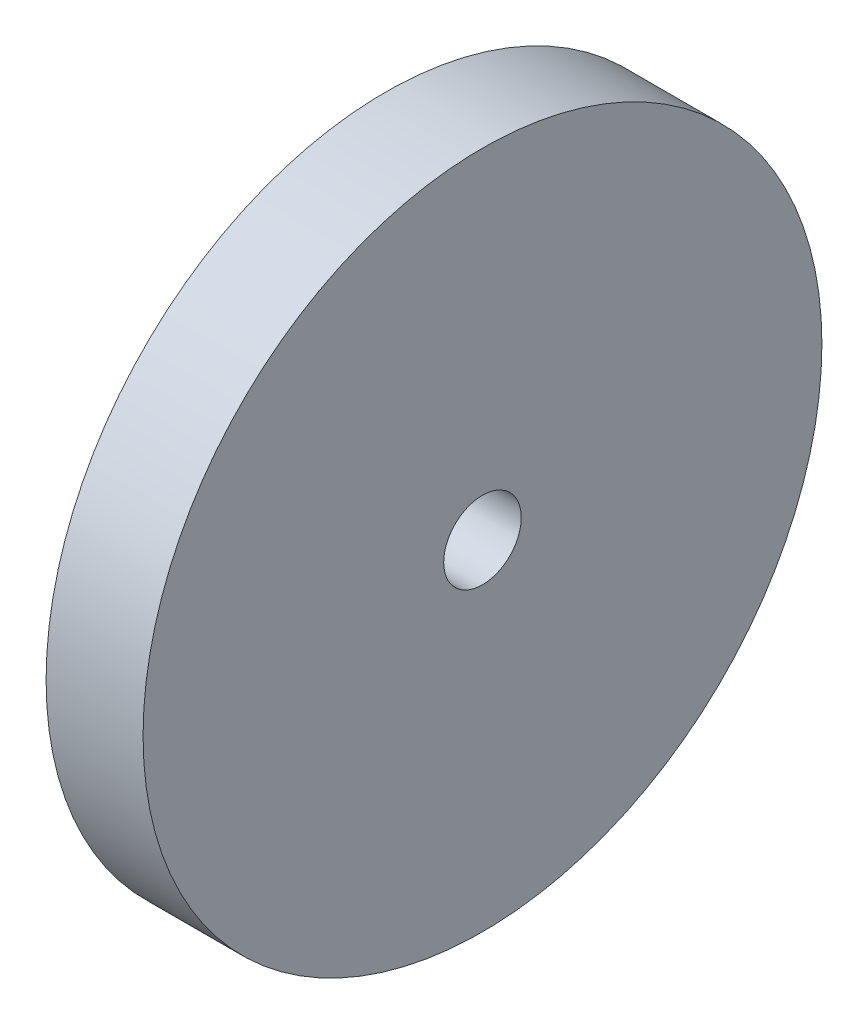
ISO-10303-21;
HEADER;
FILE_DESCRIPTION(('STEP AP214'),'2;1');
FILE_NAME('part.step','',(''),(''),'','','');
FILE_SCHEMA(('AUTOMOTIVE_DESIGN { 1 0 10303 214 1 1 1 1 }'));
ENDSEC;
DATA;
#1=APPLICATION_CONTEXT('core data for automotive mechanical design processes');
#2=APPLICATION_PROTOCOL_DEFINITION('international standard','automotive_design',2000,#1);
#3=PRODUCT_CONTEXT('',#1,'mechanical');
#4=PRODUCT('Part','Part','',(#3));
#5=PRODUCT_RELATED_PRODUCT_CATEGORY('part','',(#4));
#6=PRODUCT_DEFINITION_FORMATION('','',#4);
#7=PRODUCT_DEFINITION_CONTEXT('part definition',#1,'design');
#8=PRODUCT_DEFINITION('design','',#6,#7);
#9=PRODUCT_DEFINITION_SHAPE('','',#8);
#10=(LENGTH_UNIT() NAMED_UNIT(*) SI_UNIT(.MILLI.,.METRE.));
#11=(NAMED_UNIT(*) PLANE_ANGLE_UNIT() SI_UNIT($,.RADIAN.));
#12=(NAMED_UNIT(*) SI_UNIT($,.STERADIAN.) SOLID_ANGLE_UNIT());
#13=UNCERTAINTY_MEASURE_WITH_UNIT(LENGTH_MEASURE(1.E-05),#10,'distance_accuracy_value','');
#14=(GEOMETRIC_REPRESENTATION_CONTEXT(3) GLOBAL_UNCERTAINTY_ASSIGNED_CONTEXT((#13)) GLOBAL_UNIT_ASSIGNED_CONTEXT((#10,
#11,#12)) REPRESENTATION_CONTEXT('',''));
#15=CARTESIAN_POINT('',(0.,0.,0.));
#16=DIRECTION('',(0.,0.,1.));
#17=DIRECTION('',(1.,0.,0.));
#18=AXIS2_PLACEMENT_3D('',#15,#16,#17);
#19=CARTESIAN_POINT('',(0.,4.,0.));
#20=DIRECTION('',(1.,0.,0.));
#21=DIRECTION('',(0.,0.,-1.));
#22=AXIS2_PLACEMENT_3D('',#19,#20,#21);
#23=PLANE('',#22);
#24=CARTESIAN_POINT('',(0.,0.,0.));
#25=DIRECTION('',(-1.,0.,0.));
#26=DIRECTION('',(0.,0.,1.));
#27=AXIS2_PLACEMENT_3D('',#24,#25,#26);
#28=CIRCLE('',#27,4.);
#29=CARTESIAN_POINT('',(0.,0.,4.));
#30=VERTEX_POINT('',#29);
#31=EDGE_CURVE('E54',#30,#30,#28,.T.);
#32=ORIENTED_EDGE('',*,*,#31,.F.);
#33=EDGE_LOOP('',(#32));
#34=FACE_BOUND('',#33,.T.);
#35=CARTESIAN_POINT('',(0.,0.,0.));
#36=DIRECTION('',(-1.,0.,0.));
#37=DIRECTION('',(0.,0.,1.));
#38=AXIS2_PLACEMENT_3D('',#35,#36,#37);
#39=CIRCLE('',#38,35.);
#40=CARTESIAN_POINT('',(0.,0.,35.));
#41=VERTEX_POINT('',#40);
#42=EDGE_CURVE('E10',#41,#41,#39,.T.);
#43=ORIENTED_EDGE('',*,*,#42,.T.);
#44=EDGE_LOOP('',(#43));
#45=FACE_BOUND('',#44,.T.);
#46=ADVANCED_FACE('F37',(#34,#45),#23,.F.);
#47=CARTESIAN_POINT('',(0.,0.,0.));
#48=DIRECTION('',(-1.,0.,0.));
#49=DIRECTION('',(0.,0.,1.));
#50=AXIS2_PLACEMENT_3D('',#47,#48,#49);
#51=CYLINDRICAL_SURFACE('',#50,35.);
#52=ORIENTED_EDGE('',*,*,#42,.F.);
#53=EDGE_LOOP('',(#52));
#54=FACE_BOUND('',#53,.T.);
#55=CARTESIAN_POINT('',(10.,0.,0.));
#56=DIRECTION('',(-1.,0.,0.));
#57=DIRECTION('',(0.,0.,1.));
#58=AXIS2_PLACEMENT_3D('',#55,#56,#57);
#59=CIRCLE('',#58,35.);
#60=CARTESIAN_POINT('',(10.,0.,35.));
#61=VERTEX_POINT('',#60);
#62=EDGE_CURVE('E44',#61,#61,#59,.T.);
#63=ORIENTED_EDGE('',*,*,#62,.T.);
#64=EDGE_LOOP('',(#63));
#65=FACE_BOUND('',#64,.T.);
#66=ADVANCED_FACE('F64',(#54,#65),#51,.T.);
#67=CARTESIAN_POINT('',(10.,35.,0.));
#68=DIRECTION('',(-1.,0.,0.));
#69=DIRECTION('',(0.,0.,1.));
#70=AXIS2_PLACEMENT_3D('',#67,#68,#69);
#71=PLANE('',#70);
#72=ORIENTED_EDGE('',*,*,#62,.F.);
#73=EDGE_LOOP('',(#72));
#74=FACE_BOUND('',#73,.T.);
#75=CARTESIAN_POINT('',(10.,0.,0.));
#76=DIRECTION('',(-1.,0.,0.));
#77=DIRECTION('',(0.,0.,1.));
#78=AXIS2_PLACEMENT_3D('',#75,#76,#77);
#79=CIRCLE('',#78,4.);
#80=CARTESIAN_POINT('',(10.,0.,4.));
#81=VERTEX_POINT('',#80);
#82=EDGE_CURVE('E49',#81,#81,#79,.T.);
#83=ORIENTED_EDGE('',*,*,#82,.T.);
#84=EDGE_LOOP('',(#83));
#85=FACE_BOUND('',#84,.T.);
#86=ADVANCED_FACE('F68',(#74,#85),#71,.F.);
#87=CARTESIAN_POINT('',(0.,0.,0.));
#88=DIRECTION('',(-1.,0.,0.));
#89=DIRECTION('',(0.,0.,1.));
#90=AXIS2_PLACEMENT_3D('',#87,#88,#89);
#91=CYLINDRICAL_SURFACE('',#90,4.);
#92=ORIENTED_EDGE('',*,*,#82,.F.);
#93=EDGE_LOOP('',(#92));
#94=FACE_BOUND('',#93,.T.);
#95=ORIENTED_EDGE('',*,*,#31,.T.);
#96=EDGE_LOOP('',(#95));
#97=FACE_BOUND('',#96,.T.);
#98=ADVANCED_FACE('F61',(#94,#97),#91,.F.);
#99=CLOSED_SHELL('',(#46,#66,#86,#98));
#100=MANIFOLD_SOLID_BREP('B2',#99);
#101=ADVANCED_BREP_SHAPE_REPRESENTATION('',(#18,#100),#14);
#102=SHAPE_DEFINITION_REPRESENTATION(#9,#101);
ENDSEC;
END-ISO-10303-21;
